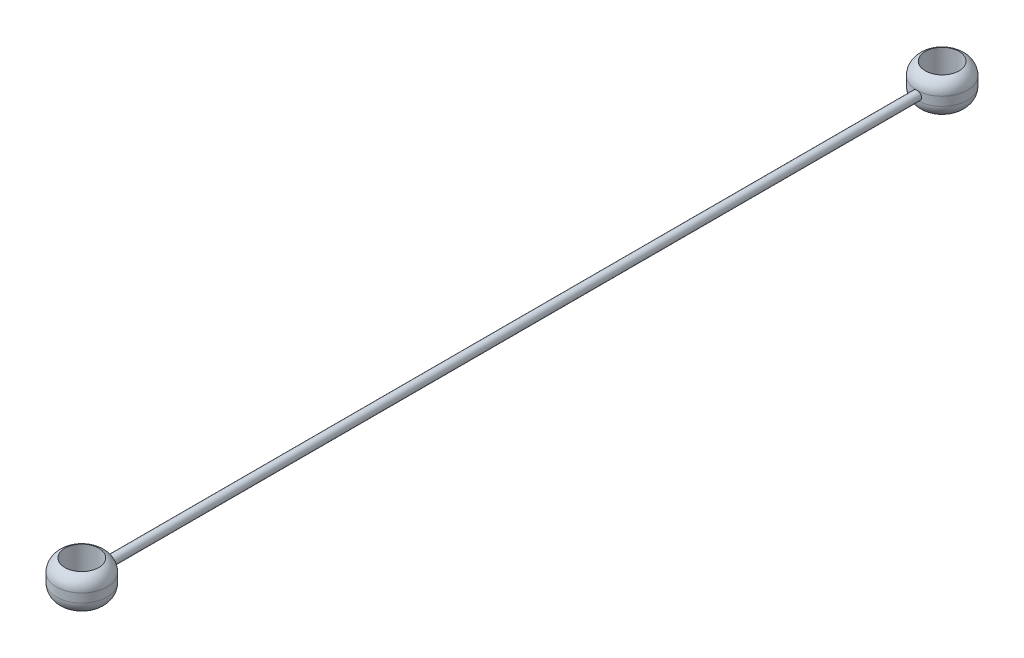
ISO-10303-21;
HEADER;
FILE_DESCRIPTION(('STEP AP214'),'2;1');
FILE_NAME('part.step','',(''),(''),'','','');
FILE_SCHEMA(('AUTOMOTIVE_DESIGN { 1 0 10303 214 1 1 1 1 }'));
ENDSEC;
DATA;
#1=APPLICATION_CONTEXT('core data for automotive mechanical design processes');
#2=APPLICATION_PROTOCOL_DEFINITION('international standard','automotive_design',2000,#1);
#3=PRODUCT_CONTEXT('',#1,'mechanical');
#4=PRODUCT('Part','Part','',(#3));
#5=PRODUCT_RELATED_PRODUCT_CATEGORY('part','',(#4));
#6=PRODUCT_DEFINITION_FORMATION('','',#4);
#7=PRODUCT_DEFINITION_CONTEXT('part definition',#1,'design');
#8=PRODUCT_DEFINITION('design','',#6,#7);
#9=PRODUCT_DEFINITION_SHAPE('','',#8);
#10=(LENGTH_UNIT() NAMED_UNIT(*) SI_UNIT(.MILLI.,.METRE.));
#11=(NAMED_UNIT(*) PLANE_ANGLE_UNIT() SI_UNIT($,.RADIAN.));
#12=(NAMED_UNIT(*) SI_UNIT($,.STERADIAN.) SOLID_ANGLE_UNIT());
#13=UNCERTAINTY_MEASURE_WITH_UNIT(LENGTH_MEASURE(1.E-05),#10,'distance_accuracy_value','');
#14=(GEOMETRIC_REPRESENTATION_CONTEXT(3) GLOBAL_UNCERTAINTY_ASSIGNED_CONTEXT((#13)) GLOBAL_UNIT_ASSIGNED_CONTEXT((#10,
#11,#12)) REPRESENTATION_CONTEXT('',''));
#15=CARTESIAN_POINT('',(0.,0.,0.));
#16=DIRECTION('',(0.,0.,1.));
#17=DIRECTION('',(1.,0.,0.));
#18=AXIS2_PLACEMENT_3D('',#15,#16,#17);
#19=CARTESIAN_POINT('',(0.,10.,-55.3250906714192));
#20=DIRECTION('',(0.,-1.,0.));
#21=DIRECTION('',(0.,0.,-1.));
#22=AXIS2_PLACEMENT_3D('',#19,#20,#21);
#23=CYLINDRICAL_SURFACE('',#22,7.5);
#24=CARTESIAN_POINT('',(0.,6.29190075645217,-55.3250906714192));
#25=DIRECTION('',(0.,1.,0.));
#26=DIRECTION('',(0.,0.,1.));
#27=AXIS2_PLACEMENT_3D('',#24,#25,#26);
#28=CIRCLE('',#27,7.5);
#29=CARTESIAN_POINT('',(0.,6.29190075645217,-47.8250906714192));
#30=VERTEX_POINT('',#29);
#31=EDGE_CURVE('E86',#30,#30,#28,.F.);
#32=ORIENTED_EDGE('',*,*,#31,.T.);
#33=EDGE_LOOP('',(#32));
#34=FACE_BOUND('',#33,.T.);
#35=CARTESIAN_POINT('',(0.231583126751752,3.70809924354783,-47.828666907023));
#36=CARTESIAN_POINT('',(0.267503856670333,3.71460222625937,-47.8297752063224));
#37=CARTESIAN_POINT('',(0.303124969464107,3.72261446951641,-47.831135716867));
#38=CARTESIAN_POINT('',(0.373545074472108,3.74159511604204,-47.8343161438407));
#39=CARTESIAN_POINT('',(0.408344168070069,3.75256315266545,-47.8361360032889));
#40=CARTESIAN_POINT('',(0.511047192644928,3.78975962328512,-47.842209316353));
#41=CARTESIAN_POINT('',(0.577405606113855,3.82030754953572,-47.8470814093694));
#42=CARTESIAN_POINT('',(0.703988809759243,3.89199794512753,-47.8579325421437));
#43=CARTESIAN_POINT('',(0.7642128427216,3.93314172019015,-47.8639117183015));
#44=CARTESIAN_POINT('',(0.876931887338768,4.02487758703904,-47.8763184505682));
#45=CARTESIAN_POINT('',(0.929426815172038,4.07546978127917,-47.8827460115387));
#46=CARTESIAN_POINT('',(1.0256496600176,4.18517659845787,-47.8953918855095));
#47=CARTESIAN_POINT('',(1.06930131168664,4.24435837880925,-47.9016080227987));
#48=CARTESIAN_POINT('',(1.14605750231173,4.36930294187747,-47.9130691045925));
#49=CARTESIAN_POINT('',(1.17916119047686,4.43506625489395,-47.9183139707408));
#50=CARTESIAN_POINT('',(1.23375927295901,4.57113679386272,-47.9272121982962));
#51=CARTESIAN_POINT('',(1.25528607414741,4.64143071229595,-47.9308699967275));
#52=CARTESIAN_POINT('',(1.28620476392514,4.78470622425719,-47.9361850077694));
#53=CARTESIAN_POINT('',(1.29559843815027,4.85768742067136,-47.9378425147611));
#54=CARTESIAN_POINT('',(1.30191374152992,5.003207507474,-47.9389529438483));
#55=CARTESIAN_POINT('',(1.29900305922335,5.07573893908051,-47.9384355074647));
#56=CARTESIAN_POINT('',(1.28118075078556,5.21926527489545,-47.9353236865949));
#57=CARTESIAN_POINT('',(1.26626910131245,5.29026017611507,-47.9327292980691));
#58=CARTESIAN_POINT('',(1.22496556786153,5.42849501368919,-47.9257736460007));
#59=CARTESIAN_POINT('',(1.19860870145701,5.49574570324367,-47.9214177746306));
#60=CARTESIAN_POINT('',(1.13519160005768,5.62489201709361,-47.9114299296225));
#61=CARTESIAN_POINT('',(1.09813058172868,5.68678724904354,-47.9057978625986));
#62=CARTESIAN_POINT('',(1.01382101829533,5.80428761713464,-47.8938056944847));
#63=CARTESIAN_POINT('',(0.966452985031019,5.85980619902328,-47.8874375040912));
#64=CARTESIAN_POINT('',(0.863106386601046,5.96215811431102,-47.8747381795877));
#65=CARTESIAN_POINT('',(0.807127302547939,6.00899092394473,-47.8684070477347));
#66=CARTESIAN_POINT('',(0.687566642766534,6.09303456457126,-47.8564304074486));
#67=CARTESIAN_POINT('',(0.623924372595015,6.13016004058055,-47.8507911982874));
#68=CARTESIAN_POINT('',(0.491200284197539,6.19317385404498,-47.8408976736522));
#69=CARTESIAN_POINT('',(0.422118790938474,6.21906286222301,-47.8366432755203));
#70=CARTESIAN_POINT('',(0.28107133823783,6.25865149004996,-47.8300296654223));
#71=CARTESIAN_POINT('',(0.209133698460756,6.27244938633367,-47.8276551889992));
#72=CARTESIAN_POINT('',(0.0639274007769111,6.28778341461838,-47.8250117718948));
#73=CARTESIAN_POINT('',(-0.00934114920407888,6.28932053645681,-47.8247426612431));
#74=CARTESIAN_POINT('',(-0.154200318808237,6.2801425595152,-47.8263302117886));
#75=CARTESIAN_POINT('',(-0.22580052784544,6.26957347254473,-47.8281615401436));
#76=CARTESIAN_POINT('',(-0.366191117634436,6.2367461010686,-47.8337061586505));
#77=CARTESIAN_POINT('',(-0.434981449641431,6.21448761387191,-47.8374194814357));
#78=CARTESIAN_POINT('',(-0.568023383171153,6.15886964769337,-47.846333384312));
#79=CARTESIAN_POINT('',(-0.632262545373136,6.12548106735002,-47.8515378581841));
#80=CARTESIAN_POINT('',(-0.754268402768512,6.04856941209291,-47.8628632260865));
#81=CARTESIAN_POINT('',(-0.81203453245661,6.00504545274013,-47.8689842000761));
#82=CARTESIAN_POINT('',(-0.920263880945693,5.90841699819341,-47.8815614808105));
#83=CARTESIAN_POINT('',(-0.970620522942119,5.85519351543076,-47.888021149656));
#84=CARTESIAN_POINT('',(-1.06171916841559,5.74102067974138,-47.9004780749875));
#85=CARTESIAN_POINT('',(-1.10246091387187,5.68007111954876,-47.9064753190614));
#86=CARTESIAN_POINT('',(-1.1733025453875,5.55187911139509,-47.9173477137745));
#87=CARTESIAN_POINT('',(-1.20336262977442,5.48461428407165,-47.922218644525));
#88=CARTESIAN_POINT('',(-1.25172475933096,5.34588615200934,-47.9302417277938));
#89=CARTESIAN_POINT('',(-1.2700278016551,5.27442320388855,-47.9333940260716));
#90=CARTESIAN_POINT('',(-1.29416013160795,5.13023594884928,-47.9375809706838));
#91=CARTESIAN_POINT('',(-1.30013521908102,5.05753676066476,-47.9386403628838));
#92=CARTESIAN_POINT('',(-1.29986014641394,4.91216559276379,-47.938591913731));
#93=CARTESIAN_POINT('',(-1.29361080144736,4.8394936115563,-47.9374842168883));
#94=CARTESIAN_POINT('',(-1.26919623468924,4.69691642387619,-47.9332512579772));
#95=CARTESIAN_POINT('',(-1.25113812005601,4.62699228091742,-47.930144134982));
#96=CARTESIAN_POINT('',(-1.20375416649336,4.49117079524475,-47.9222838691984));
#97=CARTESIAN_POINT('',(-1.17442762765513,4.42527370295534,-47.9175306241674));
#98=CARTESIAN_POINT('',(-1.10507259428111,4.29878626299044,-47.9068664649787));
#99=CARTESIAN_POINT('',(-1.06495997677147,4.238242825656,-47.9009465530646));
#100=CARTESIAN_POINT('',(-0.975254438385605,4.12468470478401,-47.8886316681548));
#101=CARTESIAN_POINT('',(-0.925660038114657,4.07167119835627,-47.8822366211214));
#102=CARTESIAN_POINT('',(-0.817653739081073,3.97398771966813,-47.8695938919236));
#103=CARTESIAN_POINT('',(-0.759137220115317,3.92943307845386,-47.8633491389232));
#104=CARTESIAN_POINT('',(-0.635384347147958,3.85079702487354,-47.8517958918854));
#105=CARTESIAN_POINT('',(-0.570152545169964,3.81670857950111,-47.8464867701551));
#106=CARTESIAN_POINT('',(-0.45899126279648,3.77011277707718,-47.8390213925111));
#107=CARTESIAN_POINT('',(-0.414469532997739,3.75424399634539,-47.8364158549663));
#108=CARTESIAN_POINT('',(-0.323990650835092,3.72744217920234,-47.8319539645342));
#109=CARTESIAN_POINT('',(-0.278035402774186,3.71650286994035,-47.8300966598267));
#110=CARTESIAN_POINT('',(-0.231583126751752,3.70809924354783,-47.828666907023));
#111=B_SPLINE_CURVE_WITH_KNOTS('',3,(#35,#36,#37,#38,#39,#40,#41,#42,#43,#44,#45,#46,#47,#48,
#49,#50,#51,#52,#53,#54,#55,#56,#57,#58,#59,#60,#61,#62,#63,#64,#65,#66,#67,#68,#69,#70,#71,#72,
#73,#74,#75,#76,#77,#78,#79,#80,#81,#82,#83,#84,#85,#86,#87,#88,#89,#90,#91,#92,#93,#94,#95,#96,
#97,#98,#99,#100,#101,#102,#103,#104,#105,#106,#107,#108,#109,#110),.UNSPECIFIED.,.F.,.F.,(4,2,
2,2,2,2,2,2,2,2,2,2,2,2,2,2,2,2,2,2,2,2,2,2,2,2,2,2,2,2,2,2,2,2,2,2,2,4),(0.,0.109495225054589,
0.218976874250607,0.437492202108653,0.656034470402081,0.874579108594772,1.09493500917734,
1.31530867900671,1.53506220858564,1.75478339328807,1.97151985579741,2.1882567398603,
2.40433512117598,2.62042931920389,2.8391765500887,3.0579369674812,3.27856072213739,
3.49917130559403,3.71797167415697,3.9367543783393,4.1529259018022,4.36910117374454,
4.58584616187804,4.80261007082401,5.02223804293854,5.24187190821446,5.46231579026049,
5.68274097324542,5.90054393778433,6.11833237885423,6.33417234721564,6.55002572408228,
6.76761403387166,6.98523632061399,7.2056407641127,7.42589677586871,7.56764308292515,
7.70920850205724),.UNSPECIFIED.);
#112=CARTESIAN_POINT('',(0.231583126751752,3.70809924354783,-47.828666907023));
#113=VERTEX_POINT('',#112);
#114=CARTESIAN_POINT('',(-0.231583126751752,3.70809924354783,-47.828666907023));
#115=VERTEX_POINT('',#114);
#116=EDGE_CURVE('E74',#113,#115,#111,.T.);
#117=ORIENTED_EDGE('',*,*,#116,.F.);
#118=CARTESIAN_POINT('',(0.,3.70809924354783,-55.3250906714192));
#119=DIRECTION('',(0.,-1.,0.));
#120=DIRECTION('',(0.,0.,-1.));
#121=AXIS2_PLACEMENT_3D('',#118,#119,#120);
#122=CIRCLE('',#121,7.5);
#123=EDGE_CURVE('E79',#113,#115,#122,.F.);
#124=ORIENTED_EDGE('',*,*,#123,.T.);
#125=EDGE_LOOP('',(#117,#124));
#126=FACE_BOUND('',#125,.T.);
#127=ADVANCED_FACE('F41',(#34,#126),#23,.T.);
#128=CARTESIAN_POINT('',(0.,3.70809924354783,-55.3250906714192));
#129=DIRECTION('',(0.,-1.,0.));
#130=DIRECTION('',(0.,0.,-1.));
#131=AXIS2_PLACEMENT_3D('',#128,#129,#130);
#132=DEGENERATE_TOROIDAL_SURFACE('',#131,3.5,4.,.T.);
#133=CARTESIAN_POINT('',(0.,0.,-55.3250906714192));
#134=DIRECTION('',(0.,1.,0.));
#135=DIRECTION('',(0.,0.,1.));
#136=AXIS2_PLACEMENT_3D('',#133,#134,#135);
#137=CIRCLE('',#136,5.);
#138=CARTESIAN_POINT('',(0.,0.,-50.3250906714192));
#139=VERTEX_POINT('',#138);
#140=EDGE_CURVE('E82',#139,#139,#137,.T.);
#141=ORIENTED_EDGE('',*,*,#140,.T.);
#142=EDGE_LOOP('',(#141));
#143=FACE_BOUND('',#142,.T.);
#144=ORIENTED_EDGE('',*,*,#123,.F.);
#145=CARTESIAN_POINT('',(0.232685167542146,3.70829924354792,-47.8287010378819));
#146=CARTESIAN_POINT('',(0.194177184741993,3.70128822556934,-47.8275066972166));
#147=CARTESIAN_POINT('',(0.155342677102726,3.69602531565862,-47.8266151828862));
#148=CARTESIAN_POINT('',(0.0776703312722436,3.68904853767692,-47.8254366573952));
#149=CARTESIAN_POINT('',(0.038835165636208,3.68730573798252,-47.8251447180185));
#150=CARTESIAN_POINT('',(-0.0388351656358638,3.68730573798251,-47.8251447180185));
#151=CARTESIAN_POINT('',(-0.0776703312719,3.6890485376769,-47.8254366573952));
#152=CARTESIAN_POINT('',(-0.155342677102384,3.69602531565858,-47.8266151828862));
#153=CARTESIAN_POINT('',(-0.194177184741653,3.70128822556928,-47.8275066972166));
#154=CARTESIAN_POINT('',(-0.232685167541808,3.70829924354786,-47.8287010378819));
#155=B_SPLINE_CURVE_WITH_KNOTS('',3,(#145,#146,#147,#148,#149,#150,#151,#152,#153,#154),
.UNSPECIFIED.,.F.,.F.,(4,2,2,2,4),(0.,0.117434980494283,0.233900775234076,0.350366569973868,
0.467801550468151),.UNSPECIFIED.);
#156=EDGE_CURVE('E71',#113,#115,#155,.T.);
#157=ORIENTED_EDGE('',*,*,#156,.T.);
#158=EDGE_LOOP('',(#144,#157));
#159=FACE_BOUND('',#158,.T.);
#160=ADVANCED_FACE('F85',(#143,#159),#132,.T.);
#161=CARTESIAN_POINT('',(0.,10.,-55.3250906714192));
#162=DIRECTION('',(0.,-1.,0.));
#163=DIRECTION('',(0.,0.,-1.));
#164=AXIS2_PLACEMENT_3D('',#161,#162,#163);
#165=CYLINDRICAL_SURFACE('',#164,5.);
#166=CARTESIAN_POINT('',(0.,10.,-55.3250906714192));
#167=DIRECTION('',(0.,1.,0.));
#168=DIRECTION('',(0.,0.,1.));
#169=AXIS2_PLACEMENT_3D('',#166,#167,#168);
#170=CIRCLE('',#169,5.);
#171=CARTESIAN_POINT('',(0.,10.,-50.3250906714192));
#172=VERTEX_POINT('',#171);
#173=EDGE_CURVE('E89',#172,#172,#170,.T.);
#174=ORIENTED_EDGE('',*,*,#173,.T.);
#175=EDGE_LOOP('',(#174));
#176=FACE_BOUND('',#175,.T.);
#177=ORIENTED_EDGE('',*,*,#140,.F.);
#178=EDGE_LOOP('',(#177));
#179=FACE_BOUND('',#178,.T.);
#180=ADVANCED_FACE('F113',(#176,#179),#165,.F.);
#181=CARTESIAN_POINT('',(0.,6.29190075645217,-55.3250906714192));
#182=DIRECTION('',(0.,1.,0.));
#183=DIRECTION('',(0.,0.,1.));
#184=AXIS2_PLACEMENT_3D('',#181,#182,#183);
#185=DEGENERATE_TOROIDAL_SURFACE('',#184,3.5,4.,.T.);
#186=ORIENTED_EDGE('',*,*,#31,.F.);
#187=EDGE_LOOP('',(#186));
#188=FACE_BOUND('',#187,.T.);
#189=ORIENTED_EDGE('',*,*,#173,.F.);
#190=EDGE_LOOP('',(#189));
#191=FACE_BOUND('',#190,.T.);
#192=ADVANCED_FACE('F110',(#188,#191),#185,.T.);
#193=CARTESIAN_POINT('',(0.,4.98730573798252,72.));
#194=DIRECTION('',(0.,0.,-1.));
#195=DIRECTION('',(-1.,0.,0.));
#196=AXIS2_PLACEMENT_3D('',#193,#194,#195);
#197=CYLINDRICAL_SURFACE('',#196,1.3);
#198=CARTESIAN_POINT('',(-1.3,4.98730573798252,191.938616546371));
#199=CARTESIAN_POINT('',(-1.2999971272218,5.05973636808262,191.938615204909));
#200=CARTESIAN_POINT('',(-1.29392618472742,5.13220547632847,191.937539626946));
#201=CARTESIAN_POINT('',(-1.26981515417485,5.27510723645544,191.933357890556));
#202=CARTESIAN_POINT('',(-1.25176430056994,5.34553799714601,191.930249905779));
#203=CARTESIAN_POINT('',(-1.20425853400162,5.4822744177427,191.922365696619));
#204=CARTESIAN_POINT('',(-1.17481348701787,5.54858358894868,191.917590915828));
#205=CARTESIAN_POINT('',(-1.10538024865049,5.67531429436743,191.906912819236));
#206=CARTESIAN_POINT('',(-1.06539313112804,5.73573642740143,191.901009618398));
#207=CARTESIAN_POINT('',(-0.975556603696098,5.84962786847079,191.888669570899));
#208=CARTESIAN_POINT('',(-0.9256167676848,5.90302536603649,191.882228171484));
#209=CARTESIAN_POINT('',(-0.817487846240058,6.00072744870125,191.869577880498));
#210=CARTESIAN_POINT('',(-0.759298256482341,6.04503147749241,191.863369003172));
#211=CARTESIAN_POINT('',(-0.635854297679096,6.12356030002222,191.851834956589));
#212=CARTESIAN_POINT('',(-0.570556630550463,6.15771798459588,191.846515768626));
#213=CARTESIAN_POINT('',(-0.435042501238987,6.21455284713361,191.837411186821));
#214=CARTESIAN_POINT('',(-0.364826385160438,6.23723083198589,191.833625685182));
#215=CARTESIAN_POINT('',(-0.222211201387026,6.27024215026437,191.828047145213));
#216=CARTESIAN_POINT('',(-0.149840867974486,6.28069627481583,191.826234623276));
#217=CARTESIAN_POINT('',(-0.00435221769875159,6.28933896085447,191.824739257411));
#218=CARTESIAN_POINT('',(0.0687660439722828,6.28752842096543,191.825056257454));
#219=CARTESIAN_POINT('',(0.212848345716744,6.27178689250685,191.827768855815));
#220=CARTESIAN_POINT('',(0.283827070398236,6.2579859187067,191.830142156485));
#221=CARTESIAN_POINT('',(0.422445797731928,6.21886028561217,191.836675791021));
#222=CARTESIAN_POINT('',(0.490085692232567,6.19353525330105,191.840836182733));
#223=CARTESIAN_POINT('',(0.620490429667305,6.13195282639313,191.850514295852));
#224=CARTESIAN_POINT('',(0.683229699346728,6.0956423527054,191.856038582894));
#225=CARTESIAN_POINT('',(0.801773592501428,6.01315871731387,191.867831587195));
#226=CARTESIAN_POINT('',(0.857577609489636,5.96698469400241,191.874100369466));
#227=CARTESIAN_POINT('',(0.961435782299692,5.86536496688361,191.886783109186));
#228=CARTESIAN_POINT('',(1.00937868020215,5.80980558955401,191.893197892316));
#229=CARTESIAN_POINT('',(1.09528042907374,5.69137394376784,191.905370405556));
#230=CARTESIAN_POINT('',(1.13323917276522,5.62850159674541,191.911128128606));
#231=CARTESIAN_POINT('',(1.19811997681335,5.49709403323197,191.921335288336));
#232=CARTESIAN_POINT('',(1.22502779203365,5.42855164361206,191.925783034323));
#233=CARTESIAN_POINT('',(1.26691605805943,5.28782519162138,191.932839369086));
#234=CARTESIAN_POINT('',(1.28189765060124,5.21564147855013,191.935448133912));
#235=CARTESIAN_POINT('',(1.299349764827,5.07067927150619,191.938496821878));
#236=CARTESIAN_POINT('',(1.30197926769026,4.99792047880902,191.938964303068));
#237=CARTESIAN_POINT('',(1.29507699314931,4.85300276786064,191.937751001213));
#238=CARTESIAN_POINT('',(1.28554572560275,4.78084382458755,191.936070308232));
#239=CARTESIAN_POINT('',(1.25472830843411,4.63968456061493,191.930775555305));
#240=CARTESIAN_POINT('',(1.23352382431757,4.57066586216433,191.927174932569));
#241=CARTESIAN_POINT('',(1.18004784709968,4.43716136328648,191.918457386644));
#242=CARTESIAN_POINT('',(1.14777564379392,4.37267585406947,191.913340366152));
#243=CARTESIAN_POINT('',(1.07270797517647,4.24936288476941,191.902102942867));
#244=CARTESIAN_POINT('',(1.02981107563909,4.19059805227343,191.895973070062));
#245=CARTESIAN_POINT('',(0.934850165836956,4.08104360412446,191.88342799036));
#246=CARTESIAN_POINT('',(0.882785455979228,4.03025459766444,191.877012761715));
#247=CARTESIAN_POINT('',(0.77026072450353,3.93750885709026,191.864532205211));
#248=CARTESIAN_POINT('',(0.709712474689744,3.89565842578145,191.858471651029));
#249=CARTESIAN_POINT('',(0.582352187627227,3.82272413705547,191.847461001748));
#250=CARTESIAN_POINT('',(0.515540365583302,3.7916399099035,191.842510868516));
#251=CARTESIAN_POINT('',(0.377858448292957,3.74128389534815,191.83429948772));
#252=CARTESIAN_POINT('',(0.307008795884207,3.72195753906842,191.831030449227));
#253=CARTESIAN_POINT('',(0.163007890116606,3.69549060322588,191.826516558181));
#254=CARTESIAN_POINT('',(0.0898568428813245,3.68834893549248,191.825271524873));
#255=CARTESIAN_POINT('',(-0.0556464046306875,3.6864874446662,191.824948800332));
#256=CARTESIAN_POINT('',(-0.127996528359766,3.69160625253047,191.825842953529));
#257=CARTESIAN_POINT('',(-0.270789743280457,3.71377002408953,191.829640342675));
#258=CARTESIAN_POINT('',(-0.341232847338832,3.73081490729764,191.832543565064));
#259=CARTESIAN_POINT('',(-0.478143452641775,3.7762831470055,191.840033747894));
#260=CARTESIAN_POINT('',(-0.544615994113234,3.80469170981452,191.844618518584));
#261=CARTESIAN_POINT('',(-0.6718757379171,3.87206253255364,191.854972606198));
#262=CARTESIAN_POINT('',(-0.732662635365505,3.91102535800403,191.860741986592));
#263=CARTESIAN_POINT('',(-0.847635854740495,3.99896569976454,191.872916393095));
#264=CARTESIAN_POINT('',(-0.901731422924527,4.04806091598848,191.879328387355));
#265=CARTESIAN_POINT('',(-1.00097290388968,4.1546261132705,191.892018449784));
#266=CARTESIAN_POINT('',(-1.0461167165659,4.21209805405577,191.898296486218));
#267=CARTESIAN_POINT('',(-1.12649613355093,4.33431394761949,191.910060387244));
#268=CARTESIAN_POINT('',(-1.16165250130153,4.39911064801783,191.915539757524));
#269=CARTESIAN_POINT('',(-1.22052654446083,4.5337604524073,191.92500880728));
#270=CARTESIAN_POINT('',(-1.24425545477761,4.60360851210457,191.928999949033));
#271=CARTESIAN_POINT('',(-1.27454857902905,4.72597531084297,191.934171649698));
#272=CARTESIAN_POINT('',(-1.28407723369136,4.77776022026108,191.93582902701));
#273=CARTESIAN_POINT('',(-1.29680392177935,4.88212524574972,191.938051951142));
#274=CARTESIAN_POINT('',(-1.30000208626186,4.93470534533515,191.938617520565));
#275=CARTESIAN_POINT('',(-1.3,4.98730573798252,191.938616546371));
#276=B_SPLINE_CURVE_WITH_KNOTS('',3,(#198,#199,#200,#201,#202,#203,#204,#205,#206,#207,#208,
#209,#210,#211,#212,#213,#214,#215,#216,#217,#218,#219,#220,#221,#222,#223,#224,#225,#226,#227,
#228,#229,#230,#231,#232,#233,#234,#235,#236,#237,#238,#239,#240,#241,#242,#243,#244,#245,#246,
#247,#248,#249,#250,#251,#252,#253,#254,#255,#256,#257,#258,#259,#260,#261,#262,#263,#264,#265,
#266,#267,#268,#269,#270,#271,#272,#273,#274,#275),.UNSPECIFIED.,.T.,.F.,(4,2,2,2,2,2,2,2,2,2,2,
2,2,2,2,2,2,2,2,2,2,2,2,2,2,2,2,2,2,2,2,2,2,2,2,2,2,2,4),(0.,0.217099498055934,
0.434394353584007,0.651501477806203,0.868586495091385,1.08774200540231,1.3069109189181,
1.52749871751367,1.74807100922139,1.96644476712598,2.18480252510432,2.40082172379478,
2.61684791520477,2.83393503240893,3.05104112051864,3.27099502669551,3.49095129613458,
3.71119021569837,3.93140804853307,4.14878359190015,4.36615002178709,4.58201473911303,
4.79789331085343,5.0159181877262,5.23395970923094,5.45446538131574,5.67496348000646,
5.89443027000545,6.11387745919095,6.33045224954492,6.54702557829309,6.76331787610147,
6.97962176561354,7.19859608079953,7.417621707303,7.63833934112177,7.85883953107498,
8.01650425448284,8.17416571380614),.UNSPECIFIED.);
#277=CARTESIAN_POINT('',(-0.231583126751752,3.70809924354783,191.828666907023));
#278=VERTEX_POINT('',#277);
#279=CARTESIAN_POINT('',(0.231583126751752,3.70809924354783,191.828666907023));
#280=VERTEX_POINT('',#279);
#281=EDGE_CURVE('E83',#278,#280,#276,.T.);
#282=ORIENTED_EDGE('',*,*,#281,.T.);
#283=CARTESIAN_POINT('',(0.231583126751752,3.70809924354783,191.828666907023));
#284=CARTESIAN_POINT('',(0.19325489467428,3.70115514087173,191.827484112325));
#285=CARTESIAN_POINT('',(0.154604823138274,3.69594250664021,191.826601176799));
#286=CARTESIAN_POINT('',(0.0773014280916706,3.6890319972444,191.825433896824));
#287=CARTESIAN_POINT('',(0.0386507140458353,3.68730573798252,191.825144718019));
#288=CARTESIAN_POINT('',(-0.0386507140458353,3.68730573798252,191.825144718019));
#289=CARTESIAN_POINT('',(-0.0773014280916706,3.6890319972444,191.825433896824));
#290=CARTESIAN_POINT('',(-0.154604823138274,3.69594250664021,191.826601176799));
#291=CARTESIAN_POINT('',(-0.19325489467428,3.70115514087173,191.827484112325));
#292=CARTESIAN_POINT('',(-0.231583126751752,3.70809924354783,191.828666907023));
#293=B_SPLINE_CURVE_WITH_KNOTS('',3,(#283,#284,#285,#286,#287,#288,#289,#290,#291,#292),
.UNSPECIFIED.,.F.,.F.,(4,2,2,2,4),(0.,0.116868374655026,0.23278137400297,0.348694373350915,
0.46556274800594),.UNSPECIFIED.);
#294=EDGE_CURVE('E11',#280,#278,#293,.T.);
#295=ORIENTED_EDGE('',*,*,#294,.T.);
#296=EDGE_LOOP('',(#282,#295));
#297=FACE_BOUND('',#296,.T.);
#298=ORIENTED_EDGE('',*,*,#156,.F.);
#299=ORIENTED_EDGE('',*,*,#116,.T.);
#300=EDGE_LOOP('',(#298,#299));
#301=FACE_BOUND('',#300,.T.);
#302=ADVANCED_FACE('F73',(#297,#301),#197,.T.);
#303=CARTESIAN_POINT('',(0.,10.,199.325090671419));
#304=DIRECTION('',(0.,-1.,0.));
#305=DIRECTION('',(0.,0.,-1.));
#306=AXIS2_PLACEMENT_3D('',#303,#304,#305);
#307=CYLINDRICAL_SURFACE('',#306,7.5);
#308=CARTESIAN_POINT('',(0.,6.29190075645217,199.325090671419));
#309=DIRECTION('',(0.,1.,0.));
#310=DIRECTION('',(0.,0.,1.));
#311=AXIS2_PLACEMENT_3D('',#308,#309,#310);
#312=CIRCLE('',#311,7.5);
#313=CARTESIAN_POINT('',(0.,6.29190075645217,206.825090671419));
#314=VERTEX_POINT('',#313);
#315=EDGE_CURVE('E78',#314,#314,#312,.F.);
#316=ORIENTED_EDGE('',*,*,#315,.T.);
#317=EDGE_LOOP('',(#316));
#318=FACE_BOUND('',#317,.T.);
#319=ORIENTED_EDGE('',*,*,#281,.F.);
#320=CARTESIAN_POINT('',(0.,3.70809924354783,199.325090671419));
#321=DIRECTION('',(0.,-1.,0.));
#322=DIRECTION('',(0.,0.,-1.));
#323=AXIS2_PLACEMENT_3D('',#320,#321,#322);
#324=CIRCLE('',#323,7.5);
#325=EDGE_CURVE('E54',#278,#280,#324,.F.);
#326=ORIENTED_EDGE('',*,*,#325,.T.);
#327=EDGE_LOOP('',(#319,#326));
#328=FACE_BOUND('',#327,.T.);
#329=ADVANCED_FACE('F109',(#318,#328),#307,.T.);
#330=CARTESIAN_POINT('',(0.,10.,199.325090671419));
#331=DIRECTION('',(0.,-1.,0.));
#332=DIRECTION('',(0.,0.,-1.));
#333=AXIS2_PLACEMENT_3D('',#330,#331,#332);
#334=CYLINDRICAL_SURFACE('',#333,5.);
#335=CARTESIAN_POINT('',(0.,10.,199.325090671419));
#336=DIRECTION('',(0.,-1.,0.));
#337=DIRECTION('',(0.,0.,-1.));
#338=AXIS2_PLACEMENT_3D('',#335,#336,#337);
#339=CIRCLE('',#338,5.);
#340=CARTESIAN_POINT('',(0.,10.,194.325090671419));
#341=VERTEX_POINT('',#340);
#342=EDGE_CURVE('E208',#341,#341,#339,.T.);
#343=ORIENTED_EDGE('',*,*,#342,.F.);
#344=EDGE_LOOP('',(#343));
#345=FACE_BOUND('',#344,.T.);
#346=CARTESIAN_POINT('',(0.,0.,199.325090671419));
#347=DIRECTION('',(0.,-1.,0.));
#348=DIRECTION('',(0.,0.,-1.));
#349=AXIS2_PLACEMENT_3D('',#346,#347,#348);
#350=CIRCLE('',#349,5.);
#351=CARTESIAN_POINT('',(0.,0.,194.325090671419));
#352=VERTEX_POINT('',#351);
#353=EDGE_CURVE('E123',#352,#352,#350,.T.);
#354=ORIENTED_EDGE('',*,*,#353,.T.);
#355=EDGE_LOOP('',(#354));
#356=FACE_BOUND('',#355,.T.);
#357=ADVANCED_FACE('F178',(#345,#356),#334,.F.);
#358=CARTESIAN_POINT('',(0.,3.70809924354783,199.325090671419));
#359=DIRECTION('',(0.,-1.,0.));
#360=DIRECTION('',(0.,0.,-1.));
#361=AXIS2_PLACEMENT_3D('',#358,#359,#360);
#362=DEGENERATE_TOROIDAL_SURFACE('',#361,3.5,4.,.T.);
#363=ORIENTED_EDGE('',*,*,#294,.F.);
#364=ORIENTED_EDGE('',*,*,#325,.F.);
#365=EDGE_LOOP('',(#363,#364));
#366=FACE_BOUND('',#365,.T.);
#367=ORIENTED_EDGE('',*,*,#353,.F.);
#368=EDGE_LOOP('',(#367));
#369=FACE_BOUND('',#368,.T.);
#370=ADVANCED_FACE('F187',(#366,#369),#362,.T.);
#371=CARTESIAN_POINT('',(0.,6.29190075645217,199.325090671419));
#372=DIRECTION('',(0.,1.,0.));
#373=DIRECTION('',(0.,0.,1.));
#374=AXIS2_PLACEMENT_3D('',#371,#372,#373);
#375=DEGENERATE_TOROIDAL_SURFACE('',#374,3.5,4.,.T.);
#376=ORIENTED_EDGE('',*,*,#342,.T.);
#377=EDGE_LOOP('',(#376));
#378=FACE_BOUND('',#377,.T.);
#379=ORIENTED_EDGE('',*,*,#315,.F.);
#380=EDGE_LOOP('',(#379));
#381=FACE_BOUND('',#380,.T.);
#382=ADVANCED_FACE('F43',(#378,#381),#375,.T.);
#383=CLOSED_SHELL('',(#127,#160,#180,#192,#302,#329,#357,#370,#382));
#384=MANIFOLD_SOLID_BREP('B2',#383);
#385=ADVANCED_BREP_SHAPE_REPRESENTATION('',(#18,#384),#14);
#386=SHAPE_DEFINITION_REPRESENTATION(#9,#385);
ENDSEC;
END-ISO-10303-21;
